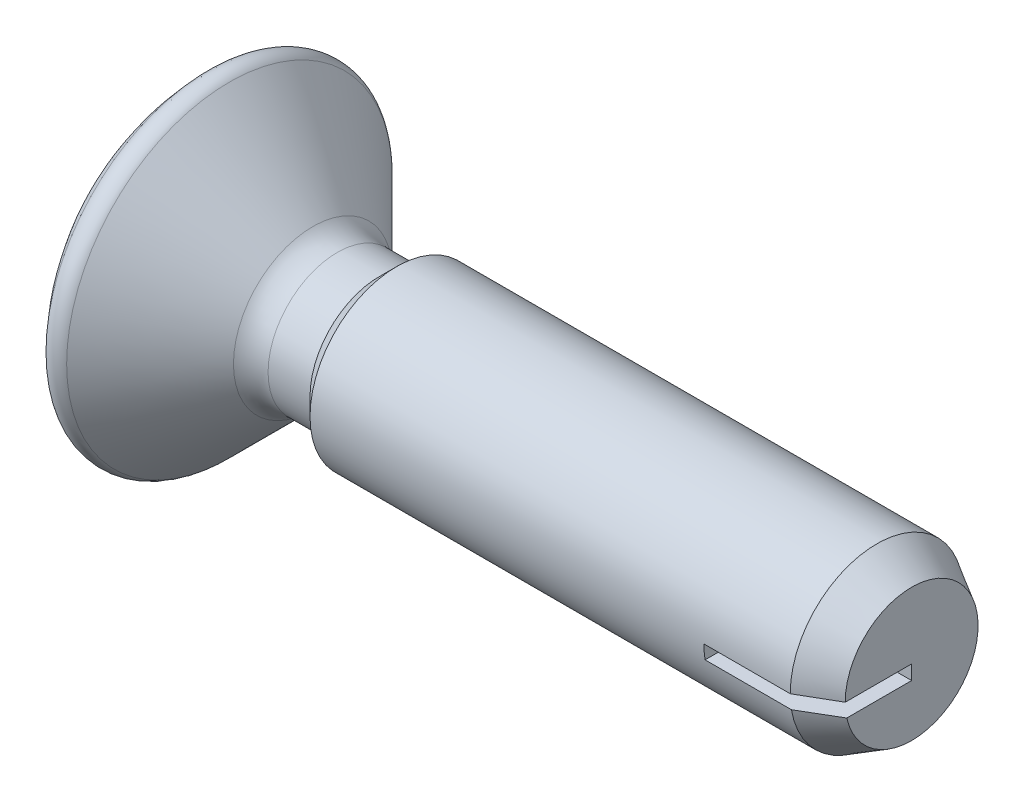
ISO-10303-21;
HEADER;
FILE_DESCRIPTION(('STEP AP214'),'2;1');
FILE_NAME('part.step','',(''),(''),'','','');
FILE_SCHEMA(('AUTOMOTIVE_DESIGN { 1 0 10303 214 1 1 1 1 }'));
ENDSEC;
DATA;
#1=APPLICATION_CONTEXT('core data for automotive mechanical design processes');
#2=APPLICATION_PROTOCOL_DEFINITION('international standard','automotive_design',2000,#1);
#3=PRODUCT_CONTEXT('',#1,'mechanical');
#4=PRODUCT('Part','Part','',(#3));
#5=PRODUCT_RELATED_PRODUCT_CATEGORY('part','',(#4));
#6=PRODUCT_DEFINITION_FORMATION('','',#4);
#7=PRODUCT_DEFINITION_CONTEXT('part definition',#1,'design');
#8=PRODUCT_DEFINITION('design','',#6,#7);
#9=PRODUCT_DEFINITION_SHAPE('','',#8);
#10=(LENGTH_UNIT() NAMED_UNIT(*) SI_UNIT(.MILLI.,.METRE.));
#11=(NAMED_UNIT(*) PLANE_ANGLE_UNIT() SI_UNIT($,.RADIAN.));
#12=(NAMED_UNIT(*) SI_UNIT($,.STERADIAN.) SOLID_ANGLE_UNIT());
#13=UNCERTAINTY_MEASURE_WITH_UNIT(LENGTH_MEASURE(1.E-05),#10,'distance_accuracy_value','');
#14=(GEOMETRIC_REPRESENTATION_CONTEXT(3) GLOBAL_UNCERTAINTY_ASSIGNED_CONTEXT((#13)) GLOBAL_UNIT_ASSIGNED_CONTEXT((#10,
#11,#12)) REPRESENTATION_CONTEXT('',''));
#15=CARTESIAN_POINT('',(0.,0.,0.));
#16=DIRECTION('',(0.,0.,1.));
#17=DIRECTION('',(1.,0.,0.));
#18=AXIS2_PLACEMENT_3D('',#15,#16,#17);
#19=CARTESIAN_POINT('',(0.,0.,0.));
#20=DIRECTION('',(-1.,0.,0.));
#21=DIRECTION('',(0.,0.,1.));
#22=AXIS2_PLACEMENT_3D('',#19,#20,#21);
#23=CYLINDRICAL_SURFACE('',#22,2.);
#24=CARTESIAN_POINT('',(4.1,0.,0.));
#25=DIRECTION('',(-1.,0.,0.));
#26=DIRECTION('',(0.,0.,1.));
#27=AXIS2_PLACEMENT_3D('',#24,#25,#26);
#28=CIRCLE('',#27,2.);
#29=CARTESIAN_POINT('',(4.1,0.,2.));
#30=VERTEX_POINT('',#29);
#31=EDGE_CURVE('E159',#30,#30,#28,.T.);
#32=ORIENTED_EDGE('',*,*,#31,.F.);
#33=EDGE_LOOP('',(#32));
#34=FACE_BOUND('',#33,.T.);
#35=DIRECTION('',(-1.,0.,0.));
#36=VECTOR('',#35,1.);
#37=CARTESIAN_POINT('',(0.,0.,2.));
#38=LINE('',#37,#36);
#39=CARTESIAN_POINT('',(15.1945963744805,0.,2.));
#40=VERTEX_POINT('',#39);
#41=CARTESIAN_POINT('',(13.2,0.,2.));
#42=VERTEX_POINT('',#41);
#43=EDGE_CURVE('E185',#40,#42,#38,.T.);
#44=ORIENTED_EDGE('',*,*,#43,.F.);
#45=CARTESIAN_POINT('',(15.1945963744805,0.,0.));
#46=DIRECTION('',(-1.,0.,0.));
#47=DIRECTION('',(0.,0.,1.));
#48=AXIS2_PLACEMENT_3D('',#45,#46,#47);
#49=CIRCLE('',#48,2.);
#50=CARTESIAN_POINT('',(15.1945963744805,-0.333333333333333,1.97202659436654));
#51=VERTEX_POINT('',#50);
#52=EDGE_CURVE('E182',#40,#51,#49,.T.);
#53=ORIENTED_EDGE('',*,*,#52,.T.);
#54=DIRECTION('',(-1.,0.,0.));
#55=VECTOR('',#54,1.);
#56=CARTESIAN_POINT('',(0.,-0.333333333333335,1.97202659436654));
#57=LINE('',#56,#55);
#58=CARTESIAN_POINT('',(13.2,-0.333333333333334,1.97202659436654));
#59=VERTEX_POINT('',#58);
#60=EDGE_CURVE('E189',#59,#51,#57,.F.);
#61=ORIENTED_EDGE('',*,*,#60,.F.);
#62=CARTESIAN_POINT('',(13.2,0.,0.));
#63=DIRECTION('',(1.,0.,0.));
#64=DIRECTION('',(0.,0.,-1.));
#65=AXIS2_PLACEMENT_3D('',#62,#63,#64);
#66=CIRCLE('',#65,2.);
#67=EDGE_CURVE('E42',#42,#59,#66,.T.);
#68=ORIENTED_EDGE('',*,*,#67,.F.);
#69=EDGE_LOOP('',(#44,#53,#61,#68));
#70=FACE_BOUND('',#69,.T.);
#71=ADVANCED_FACE('F68',(#34,#70),#23,.T.);
#72=CARTESIAN_POINT('',(15.1945963744805,0.,0.));
#73=DIRECTION('',(-1.,0.,0.));
#74=DIRECTION('',(0.,0.,1.));
#75=AXIS2_PLACEMENT_3D('',#72,#73,#74);
#76=CONICAL_SURFACE('',#75,2.,0.523598775598293);
#77=ORIENTED_EDGE('',*,*,#52,.F.);
#78=DIRECTION('',(-0.866025403784442,0.,0.499999999999995));
#79=VECTOR('',#78,1.);
#80=CARTESIAN_POINT('',(18.6586979896183,0.,0.));
#81=LINE('',#80,#79);
#82=CARTESIAN_POINT('',(16.,0.,1.535));
#83=VERTEX_POINT('',#82);
#84=EDGE_CURVE('E187',#40,#83,#81,.F.);
#85=ORIENTED_EDGE('',*,*,#84,.T.);
#86=CARTESIAN_POINT('',(16.,0.,0.));
#87=DIRECTION('',(-1.,0.,0.));
#88=DIRECTION('',(0.,0.,1.));
#89=AXIS2_PLACEMENT_3D('',#86,#87,#88);
#90=CIRCLE('',#89,1.535);
#91=CARTESIAN_POINT('',(16.,-0.333333333333333,1.49837041110965));
#92=VERTEX_POINT('',#91);
#93=EDGE_CURVE('E145',#83,#92,#90,.T.);
#94=ORIENTED_EDGE('',*,*,#93,.T.);
#95=CARTESIAN_POINT('',(17.7245765824782,-0.333333333333333,0.423969130143515));
#96=CARTESIAN_POINT('',(17.7003740457095,-0.333333333333333,0.441731979885033));
#97=CARTESIAN_POINT('',(17.6759825511919,-0.333333333333333,0.459232622890561));
#98=CARTESIAN_POINT('',(17.6269078263048,-0.333333333333333,0.49381503061348));
#99=CARTESIAN_POINT('',(17.6022246273063,-0.333333333333333,0.510896839776992));
#100=CARTESIAN_POINT('',(17.5278722925052,-0.333333333333333,0.561668721062015));
#101=CARTESIAN_POINT('',(17.4778872579111,-0.333333333333333,0.594894723857972));
#102=CARTESIAN_POINT('',(17.3774348727685,-0.333333333333333,0.660556630402269));
#103=CARTESIAN_POINT('',(17.3269677359497,-0.333333333333333,0.692992863530276));
#104=CARTESIAN_POINT('',(17.2256954006842,-0.333333333333333,0.757342083018797));
#105=CARTESIAN_POINT('',(17.1748901731657,-0.333333333333333,0.789255023543164));
#106=CARTESIAN_POINT('',(17.0279577740192,-0.333333333333333,0.880817693719197));
#107=CARTESIAN_POINT('',(16.9315407131426,-0.333333333333333,0.940001352859289));
#108=CARTESIAN_POINT('',(16.7382584243443,-0.333333333333333,1.0576330305723));
#109=CARTESIAN_POINT('',(16.6413931876779,-0.333333333333333,1.11608103470784));
#110=CARTESIAN_POINT('',(16.3503178331719,-0.333333333333333,1.29078741345151));
#111=CARTESIAN_POINT('',(16.1556992156578,-0.333333333333333,1.40636454218393));
#112=CARTESIAN_POINT('',(15.8117855109857,-0.333333333333333,1.60961313435381));
#113=CARTESIAN_POINT('',(15.6625918069533,-0.333333333333333,1.69745704925349));
#114=CARTESIAN_POINT('',(15.3640150959636,-0.333333333333333,1.87282276563437));
#115=CARTESIAN_POINT('',(15.2146320890848,-0.333333333333333,1.96034456724913));
#116=CARTESIAN_POINT('',(14.9158541084658,-0.333333333333333,2.1351138476056));
#117=CARTESIAN_POINT('',(14.7664592252995,-0.333333333333333,2.22236148136734));
#118=CARTESIAN_POINT('',(14.467580965648,-0.333333333333333,2.3967043501564));
#119=CARTESIAN_POINT('',(14.318097589348,-0.333333333333334,2.48379958550104));
#120=CARTESIAN_POINT('',(14.1685865686968,-0.333333333333334,2.5708472817961));
#121=B_SPLINE_CURVE_WITH_KNOTS('',3,(#95,#96,#97,#98,#99,#100,#101,#102,#103,#104,#105,#106,
#107,#108,#109,#110,#111,#112,#113,#114,#115,#116,#117,#118,#119,#120),.UNSPECIFIED.,.F.,.F.,(4,
2,2,2,2,2,2,2,2,2,2,2,4),(0.,0.0900582312371465,0.180106863879654,0.360155492792023,
0.540127698161719,0.720115584310137,1.05950608853919,1.39890324302172,2.07794788471721,
2.59734938198934,3.11675066387127,3.63576777514391,4.15478380441622),.UNSPECIFIED.);
#122=EDGE_CURVE('E191',#92,#51,#121,.T.);
#123=ORIENTED_EDGE('',*,*,#122,.T.);
#124=EDGE_LOOP('',(#77,#85,#94,#123));
#125=FACE_BOUND('',#124,.T.);
#126=ADVANCED_FACE('F200',(#125),#76,.T.);
#127=CARTESIAN_POINT('',(16.,2.,0.));
#128=DIRECTION('',(-1.,0.,0.));
#129=DIRECTION('',(0.,0.,1.));
#130=AXIS2_PLACEMENT_3D('',#127,#128,#129);
#131=PLANE('',#130);
#132=DIRECTION('',(0.,0.,1.));
#133=VECTOR('',#132,1.);
#134=CARTESIAN_POINT('',(16.,0.,0.));
#135=LINE('',#134,#133);
#136=CARTESIAN_POINT('',(16.,0.,0.));
#137=VERTEX_POINT('',#136);
#138=EDGE_CURVE('E76',#137,#83,#135,.T.);
#139=ORIENTED_EDGE('',*,*,#138,.F.);
#140=DIRECTION('',(0.,1.,0.));
#141=VECTOR('',#140,1.);
#142=CARTESIAN_POINT('',(16.,0.,0.));
#143=LINE('',#142,#141);
#144=CARTESIAN_POINT('',(16.,-0.333333333333333,0.));
#145=VERTEX_POINT('',#144);
#146=EDGE_CURVE('E135',#145,#137,#143,.T.);
#147=ORIENTED_EDGE('',*,*,#146,.F.);
#148=DIRECTION('',(0.,0.,-1.));
#149=VECTOR('',#148,1.);
#150=CARTESIAN_POINT('',(16.,-0.333333333333333,0.));
#151=LINE('',#150,#149);
#152=EDGE_CURVE('E146',#92,#145,#151,.T.);
#153=ORIENTED_EDGE('',*,*,#152,.F.);
#154=ORIENTED_EDGE('',*,*,#93,.F.);
#155=EDGE_LOOP('',(#139,#147,#153,#154));
#156=FACE_BOUND('',#155,.T.);
#157=ADVANCED_FACE('F143',(#156),#131,.F.);
#158=CARTESIAN_POINT('',(3.75756413828113,0.,0.));
#159=DIRECTION('',(-1.,0.,0.));
#160=DIRECTION('',(0.,1.,0.));
#161=AXIS2_PLACEMENT_3D('',#158,#159,#160);
#162=SPHERICAL_SURFACE('',#161,5.48810424949239);
#163=CARTESIAN_POINT('',(-0.730540111211259,0.,0.));
#164=DIRECTION('',(1.,0.,0.));
#165=DIRECTION('',(0.,0.,-1.));
#166=AXIS2_PLACEMENT_3D('',#163,#164,#165);
#167=CIRCLE('',#166,3.15851365344283);
#168=CARTESIAN_POINT('',(-0.730540111211259,-0.6,-3.1010012091234));
#169=VERTEX_POINT('',#168);
#170=CARTESIAN_POINT('',(-0.730540111211259,0.6,-3.1010012091234));
#171=VERTEX_POINT('',#170);
#172=EDGE_CURVE('E153',#169,#171,#167,.T.);
#173=ORIENTED_EDGE('',*,*,#172,.T.);
#174=CARTESIAN_POINT('',(3.75756413828113,0.6,0.));
#175=DIRECTION('',(0.,1.,0.));
#176=DIRECTION('',(0.,0.,1.));
#177=AXIS2_PLACEMENT_3D('',#174,#175,#176);
#178=CIRCLE('',#177,5.45520744365385);
#179=CARTESIAN_POINT('',(-0.730540111211259,0.6,3.1010012091234));
#180=VERTEX_POINT('',#179);
#181=EDGE_CURVE('E147',#171,#180,#178,.T.);
#182=ORIENTED_EDGE('',*,*,#181,.T.);
#183=CARTESIAN_POINT('',(-0.730540111211259,-0.6,3.1010012091234));
#184=VERTEX_POINT('',#183);
#185=EDGE_CURVE('E152',#180,#184,#167,.T.);
#186=ORIENTED_EDGE('',*,*,#185,.T.);
#187=CARTESIAN_POINT('',(3.75756413828113,-0.6,0.));
#188=DIRECTION('',(0.,-1.,0.));
#189=DIRECTION('',(0.,0.,-1.));
#190=AXIS2_PLACEMENT_3D('',#187,#188,#189);
#191=CIRCLE('',#190,5.45520744365385);
#192=EDGE_CURVE('E156',#184,#169,#191,.T.);
#193=ORIENTED_EDGE('',*,*,#192,.T.);
#194=EDGE_LOOP('',(#173,#182,#186,#193));
#195=FACE_BOUND('',#194,.T.);
#196=CARTESIAN_POINT('',(-0.246219246371892,0.,0.));
#197=DIRECTION('',(-1.,0.,0.));
#198=DIRECTION('',(0.,0.,1.));
#199=AXIS2_PLACEMENT_3D('',#196,#197,#198);
#200=CIRCLE('',#199,3.75353258438938);
#201=CARTESIAN_POINT('',(-0.246219246371892,0.,3.75353258438938));
#202=VERTEX_POINT('',#201);
#203=EDGE_CURVE('E174',#202,#202,#200,.T.);
#204=ORIENTED_EDGE('',*,*,#203,.T.);
#205=EDGE_LOOP('',(#204));
#206=FACE_BOUND('',#205,.T.);
#207=ADVANCED_FACE('F70',(#195,#206),#162,.T.);
#208=CARTESIAN_POINT('',(4.1,0.,0.));
#209=DIRECTION('',(1.,0.,0.));
#210=DIRECTION('',(0.,0.,-1.));
#211=AXIS2_PLACEMENT_3D('',#208,#209,#210);
#212=CONICAL_SURFACE('',#211,2.,0.785398163397443);
#213=CARTESIAN_POINT('',(3.7,0.,0.));
#214=DIRECTION('',(-1.,0.,0.));
#215=DIRECTION('',(0.,0.,1.));
#216=AXIS2_PLACEMENT_3D('',#213,#214,#215);
#217=CIRCLE('',#216,1.6);
#218=CARTESIAN_POINT('',(3.7,0.,1.6));
#219=VERTEX_POINT('',#218);
#220=EDGE_CURVE('E162',#219,#219,#217,.T.);
#221=ORIENTED_EDGE('',*,*,#220,.F.);
#222=EDGE_LOOP('',(#221));
#223=FACE_BOUND('',#222,.T.);
#224=ORIENTED_EDGE('',*,*,#31,.T.);
#225=EDGE_LOOP('',(#224));
#226=FACE_BOUND('',#225,.T.);
#227=ADVANCED_FACE('F227',(#223,#226),#212,.T.);
#228=CARTESIAN_POINT('',(0.,0.,0.));
#229=DIRECTION('',(-1.,0.,0.));
#230=DIRECTION('',(0.,0.,1.));
#231=AXIS2_PLACEMENT_3D('',#228,#229,#230);
#232=CYLINDRICAL_SURFACE('',#231,1.6);
#233=CARTESIAN_POINT('',(2.73137084989847,0.,0.));
#234=DIRECTION('',(-1.,0.,0.));
#235=DIRECTION('',(0.,0.,1.));
#236=AXIS2_PLACEMENT_3D('',#233,#234,#235);
#237=CIRCLE('',#236,1.6);
#238=CARTESIAN_POINT('',(2.73137084989847,0.,1.6));
#239=VERTEX_POINT('',#238);
#240=EDGE_CURVE('E165',#239,#239,#237,.T.);
#241=ORIENTED_EDGE('',*,*,#240,.F.);
#242=EDGE_LOOP('',(#241));
#243=FACE_BOUND('',#242,.T.);
#244=ORIENTED_EDGE('',*,*,#220,.T.);
#245=EDGE_LOOP('',(#244));
#246=FACE_BOUND('',#245,.T.);
#247=ADVANCED_FACE('F237',(#243,#246),#232,.T.);
#248=CARTESIAN_POINT('',(2.73137084989847,0.,0.));
#249=DIRECTION('',(-1.,0.,0.));
#250=DIRECTION('',(0.,0.,1.));
#251=AXIS2_PLACEMENT_3D('',#248,#249,#250);
#252=TOROIDAL_SURFACE('',#251,2.4,0.8);
#253=CARTESIAN_POINT('',(2.16568542494923,0.,0.));
#254=DIRECTION('',(-1.,0.,0.));
#255=DIRECTION('',(0.,0.,1.));
#256=AXIS2_PLACEMENT_3D('',#253,#254,#255);
#257=CIRCLE('',#256,1.83431457505076);
#258=CARTESIAN_POINT('',(2.16568542494923,0.,1.83431457505076));
#259=VERTEX_POINT('',#258);
#260=EDGE_CURVE('E168',#259,#259,#257,.T.);
#261=ORIENTED_EDGE('',*,*,#260,.F.);
#262=EDGE_LOOP('',(#261));
#263=FACE_BOUND('',#262,.T.);
#264=ORIENTED_EDGE('',*,*,#240,.T.);
#265=EDGE_LOOP('',(#264));
#266=FACE_BOUND('',#265,.T.);
#267=ADVANCED_FACE('F252',(#263,#266),#252,.F.);
#268=CARTESIAN_POINT('',(2.16568542494923,0.,0.));
#269=DIRECTION('',(-1.,0.,0.));
#270=DIRECTION('',(0.,0.,1.));
#271=AXIS2_PLACEMENT_3D('',#268,#269,#270);
#272=CONICAL_SURFACE('',#271,1.83431457505076,0.78539816339745);
#273=CARTESIAN_POINT('',(0.23864853865046,0.,0.));
#274=DIRECTION('',(-1.,0.,0.));
#275=DIRECTION('',(0.,0.,1.));
#276=AXIS2_PLACEMENT_3D('',#273,#274,#275);
#277=CIRCLE('',#276,3.76135146134954);
#278=CARTESIAN_POINT('',(0.23864853865046,0.,3.76135146134954));
#279=VERTEX_POINT('',#278);
#280=EDGE_CURVE('E171',#279,#279,#277,.T.);
#281=ORIENTED_EDGE('',*,*,#280,.F.);
#282=EDGE_LOOP('',(#281));
#283=FACE_BOUND('',#282,.T.);
#284=ORIENTED_EDGE('',*,*,#260,.T.);
#285=EDGE_LOOP('',(#284));
#286=FACE_BOUND('',#285,.T.);
#287=ADVANCED_FACE('F246',(#283,#286),#272,.T.);
#288=CARTESIAN_POINT('',(0.,0.,0.));
#289=DIRECTION('',(-1.,0.,0.));
#290=DIRECTION('',(0.,0.,1.));
#291=AXIS2_PLACEMENT_3D('',#288,#289,#290);
#292=TOROIDAL_SURFACE('',#291,3.52270292269908,0.337499999999999);
#293=ORIENTED_EDGE('',*,*,#203,.F.);
#294=EDGE_LOOP('',(#293));
#295=FACE_BOUND('',#294,.T.);
#296=ORIENTED_EDGE('',*,*,#280,.T.);
#297=EDGE_LOOP('',(#296));
#298=FACE_BOUND('',#297,.T.);
#299=ADVANCED_FACE('F242',(#295,#298),#292,.T.);
#300=CARTESIAN_POINT('',(-1.73054011121126,0.6,-3.86020292269908));
#301=DIRECTION('',(0.,1.,0.));
#302=DIRECTION('',(0.,0.,1.));
#303=AXIS2_PLACEMENT_3D('',#300,#301,#302);
#304=PLANE('',#303);
#305=DIRECTION('',(0.,0.,1.));
#306=VECTOR('',#305,1.);
#307=CARTESIAN_POINT('',(-0.730540111211258,0.6,-3.86020292269908));
#308=LINE('',#307,#306);
#309=EDGE_CURVE('E177',#171,#180,#308,.T.);
#310=ORIENTED_EDGE('',*,*,#309,.T.);
#311=ORIENTED_EDGE('',*,*,#181,.F.);
#312=EDGE_LOOP('',(#310,#311));
#313=FACE_BOUND('',#312,.T.);
#314=ADVANCED_FACE('F245',(#313),#304,.F.);
#315=CARTESIAN_POINT('',(-0.730540111211258,0.6,-3.86020292269908));
#316=DIRECTION('',(1.,0.,0.));
#317=DIRECTION('',(0.,0.,-1.));
#318=AXIS2_PLACEMENT_3D('',#315,#316,#317);
#319=PLANE('',#318);
#320=ORIENTED_EDGE('',*,*,#309,.F.);
#321=ORIENTED_EDGE('',*,*,#172,.F.);
#322=DIRECTION('',(0.,0.,1.));
#323=VECTOR('',#322,1.);
#324=CARTESIAN_POINT('',(-0.730540111211258,-0.6,-3.86020292269908));
#325=LINE('',#324,#323);
#326=EDGE_CURVE('E90',#169,#184,#325,.T.);
#327=ORIENTED_EDGE('',*,*,#326,.T.);
#328=ORIENTED_EDGE('',*,*,#185,.F.);
#329=EDGE_LOOP('',(#320,#321,#327,#328));
#330=FACE_BOUND('',#329,.T.);
#331=ADVANCED_FACE('F270',(#330),#319,.F.);
#332=CARTESIAN_POINT('',(-1.73054011121126,-0.6,-3.86020292269908));
#333=DIRECTION('',(0.,-1.,0.));
#334=DIRECTION('',(0.,0.,-1.));
#335=AXIS2_PLACEMENT_3D('',#332,#333,#334);
#336=PLANE('',#335);
#337=ORIENTED_EDGE('',*,*,#326,.F.);
#338=ORIENTED_EDGE('',*,*,#192,.F.);
#339=EDGE_LOOP('',(#337,#338));
#340=FACE_BOUND('',#339,.T.);
#341=ADVANCED_FACE('F212',(#340),#336,.F.);
#342=CARTESIAN_POINT('',(13.2,0.,3.86020292269908));
#343=DIRECTION('',(1.,0.,0.));
#344=DIRECTION('',(0.,0.,-1.));
#345=AXIS2_PLACEMENT_3D('',#342,#343,#344);
#346=PLANE('',#345);
#347=ORIENTED_EDGE('',*,*,#67,.T.);
#348=DIRECTION('',(0.,0.,-1.));
#349=VECTOR('',#348,1.);
#350=CARTESIAN_POINT('',(13.2,-0.333333333333334,3.86020292269908));
#351=LINE('',#350,#349);
#352=CARTESIAN_POINT('',(13.2,-0.333333333333334,0.));
#353=VERTEX_POINT('',#352);
#354=EDGE_CURVE('E371',#59,#353,#351,.T.);
#355=ORIENTED_EDGE('',*,*,#354,.T.);
#356=DIRECTION('',(0.,-1.,0.));
#357=VECTOR('',#356,1.);
#358=CARTESIAN_POINT('',(13.2,0.,0.));
#359=LINE('',#358,#357);
#360=CARTESIAN_POINT('',(13.2,0.,0.));
#361=VERTEX_POINT('',#360);
#362=EDGE_CURVE('E134',#361,#353,#359,.T.);
#363=ORIENTED_EDGE('',*,*,#362,.F.);
#364=DIRECTION('',(0.,0.,-1.));
#365=VECTOR('',#364,1.);
#366=CARTESIAN_POINT('',(13.2,0.,3.86020292269908));
#367=LINE('',#366,#365);
#368=EDGE_CURVE('E132',#42,#361,#367,.T.);
#369=ORIENTED_EDGE('',*,*,#368,.F.);
#370=EDGE_LOOP('',(#347,#355,#363,#369));
#371=FACE_BOUND('',#370,.T.);
#372=ADVANCED_FACE('F210',(#371),#346,.T.);
#373=CARTESIAN_POINT('',(16.,0.,3.86020292269908));
#374=DIRECTION('',(0.,-1.,0.));
#375=DIRECTION('',(1.,0.,0.));
#376=AXIS2_PLACEMENT_3D('',#373,#374,#375);
#377=PLANE('',#376);
#378=ORIENTED_EDGE('',*,*,#43,.T.);
#379=ORIENTED_EDGE('',*,*,#368,.T.);
#380=DIRECTION('',(-1.,0.,0.));
#381=VECTOR('',#380,1.);
#382=CARTESIAN_POINT('',(16.,0.,0.));
#383=LINE('',#382,#381);
#384=EDGE_CURVE('E127',#137,#361,#383,.T.);
#385=ORIENTED_EDGE('',*,*,#384,.F.);
#386=ORIENTED_EDGE('',*,*,#138,.T.);
#387=ORIENTED_EDGE('',*,*,#84,.F.);
#388=EDGE_LOOP('',(#378,#379,#385,#386,#387));
#389=FACE_BOUND('',#388,.T.);
#390=ADVANCED_FACE('F128',(#389),#377,.T.);
#391=CARTESIAN_POINT('',(16.,-0.333333333333333,3.86020292269908));
#392=DIRECTION('',(0.,1.,0.));
#393=DIRECTION('',(-1.,0.,0.));
#394=AXIS2_PLACEMENT_3D('',#391,#392,#393);
#395=PLANE('',#394);
#396=ORIENTED_EDGE('',*,*,#60,.T.);
#397=ORIENTED_EDGE('',*,*,#122,.F.);
#398=ORIENTED_EDGE('',*,*,#152,.T.);
#399=DIRECTION('',(1.,0.,0.));
#400=VECTOR('',#399,1.);
#401=CARTESIAN_POINT('',(16.,-0.333333333333333,0.));
#402=LINE('',#401,#400);
#403=EDGE_CURVE('E83',#353,#145,#402,.T.);
#404=ORIENTED_EDGE('',*,*,#403,.F.);
#405=ORIENTED_EDGE('',*,*,#354,.F.);
#406=EDGE_LOOP('',(#396,#397,#398,#404,#405));
#407=FACE_BOUND('',#406,.T.);
#408=ADVANCED_FACE('F204',(#407),#395,.T.);
#409=CARTESIAN_POINT('',(16.,0.,0.));
#410=DIRECTION('',(0.,0.,-1.));
#411=DIRECTION('',(-1.,0.,0.));
#412=AXIS2_PLACEMENT_3D('',#409,#410,#411);
#413=PLANE('',#412);
#414=ORIENTED_EDGE('',*,*,#146,.T.);
#415=ORIENTED_EDGE('',*,*,#384,.T.);
#416=ORIENTED_EDGE('',*,*,#362,.T.);
#417=ORIENTED_EDGE('',*,*,#403,.T.);
#418=EDGE_LOOP('',(#414,#415,#416,#417));
#419=FACE_BOUND('',#418,.T.);
#420=ADVANCED_FACE('F138',(#419),#413,.F.);
#421=CLOSED_SHELL('',(#71,#126,#157,#207,#227,#247,#267,#287,#299,#314,#331,#341,#372,#390,#408,#420));
#422=MANIFOLD_SOLID_BREP('B6',#421);
#423=ADVANCED_BREP_SHAPE_REPRESENTATION('',(#18,#422),#14);
#424=SHAPE_DEFINITION_REPRESENTATION(#9,#423);
ENDSEC;
END-ISO-10303-21;
